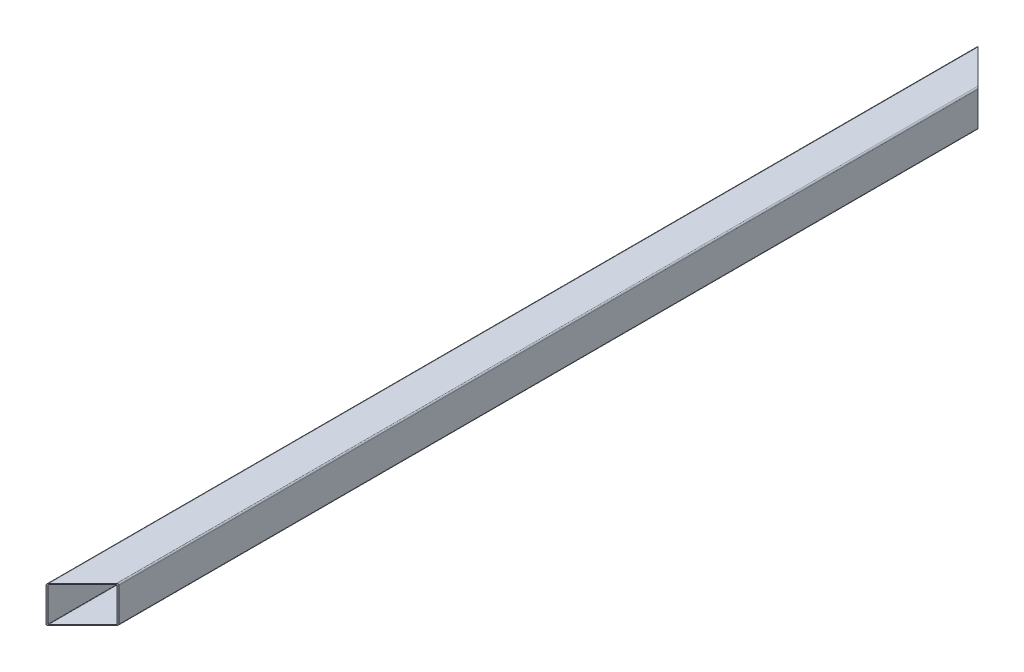
ISO-10303-21;
HEADER;
FILE_DESCRIPTION(('STEP AP214'),'2;1');
FILE_NAME('part.step','',(''),(''),'','','');
FILE_SCHEMA(('AUTOMOTIVE_DESIGN { 1 0 10303 214 1 1 1 1 }'));
ENDSEC;
DATA;
#1=APPLICATION_CONTEXT('core data for automotive mechanical design processes');
#2=APPLICATION_PROTOCOL_DEFINITION('international standard','automotive_design',2000,#1);
#3=PRODUCT_CONTEXT('',#1,'mechanical');
#4=PRODUCT('Part','Part','',(#3));
#5=PRODUCT_RELATED_PRODUCT_CATEGORY('part','',(#4));
#6=PRODUCT_DEFINITION_FORMATION('','',#4);
#7=PRODUCT_DEFINITION_CONTEXT('part definition',#1,'design');
#8=PRODUCT_DEFINITION('design','',#6,#7);
#9=PRODUCT_DEFINITION_SHAPE('','',#8);
#10=(LENGTH_UNIT() NAMED_UNIT(*) SI_UNIT(.MILLI.,.METRE.));
#11=(NAMED_UNIT(*) PLANE_ANGLE_UNIT() SI_UNIT($,.RADIAN.));
#12=(NAMED_UNIT(*) SI_UNIT($,.STERADIAN.) SOLID_ANGLE_UNIT());
#13=UNCERTAINTY_MEASURE_WITH_UNIT(LENGTH_MEASURE(1.E-05),#10,'distance_accuracy_value','');
#14=(GEOMETRIC_REPRESENTATION_CONTEXT(3) GLOBAL_UNCERTAINTY_ASSIGNED_CONTEXT((#13)) GLOBAL_UNIT_ASSIGNED_CONTEXT((#10,
#11,#12)) REPRESENTATION_CONTEXT('',''));
#15=CARTESIAN_POINT('',(0.,0.,0.));
#16=DIRECTION('',(0.,0.,1.));
#17=DIRECTION('',(1.,0.,0.));
#18=AXIS2_PLACEMENT_3D('',#15,#16,#17);
#19=CARTESIAN_POINT('',(-18.5,18.5,-1020.));
#20=DIRECTION('',(0.,0.,1.));
#21=DIRECTION('',(1.,0.,0.));
#22=AXIS2_PLACEMENT_3D('',#19,#20,#21);
#23=CYLINDRICAL_SURFACE('',#22,1.5);
#24=DIRECTION('',(0.,0.,1.));
#25=VECTOR('',#24,1.);
#26=CARTESIAN_POINT('',(-20.,18.5,-1020.));
#27=LINE('',#26,#25);
#28=CARTESIAN_POINT('',(-20.,18.5,-1020.));
#29=VERTEX_POINT('',#28);
#30=CARTESIAN_POINT('',(-20.,18.5,0.));
#31=VERTEX_POINT('',#30);
#32=EDGE_CURVE('E201',#29,#31,#27,.T.);
#33=ORIENTED_EDGE('',*,*,#32,.T.);
#34=CARTESIAN_POINT('',(-18.5,18.5,-1.50000000000006));
#35=DIRECTION('',(-0.707106781186556,0.,-0.707106781186539));
#36=DIRECTION('',(-0.707106781186539,0.,0.707106781186556));
#37=AXIS2_PLACEMENT_3D('',#34,#35,#36);
#38=ELLIPSE('',#37,2.12132034355966,1.5);
#39=CARTESIAN_POINT('',(-18.5000000000001,20.,-1.49999999999995));
#40=VERTEX_POINT('',#39);
#41=EDGE_CURVE('E181',#31,#40,#38,.T.);
#42=ORIENTED_EDGE('',*,*,#41,.T.);
#43=DIRECTION('',(0.,0.,1.));
#44=VECTOR('',#43,1.);
#45=CARTESIAN_POINT('',(-18.5,20.,-1020.));
#46=LINE('',#45,#44);
#47=CARTESIAN_POINT('',(-18.5,20.,-1018.5));
#48=VERTEX_POINT('',#47);
#49=EDGE_CURVE('E12',#48,#40,#46,.T.);
#50=ORIENTED_EDGE('',*,*,#49,.F.);
#51=CARTESIAN_POINT('',(-18.5,18.5,-1018.5));
#52=DIRECTION('',(-0.707106781186539,0.,0.707106781186556));
#53=DIRECTION('',(0.707106781186556,0.,0.707106781186539));
#54=AXIS2_PLACEMENT_3D('',#51,#52,#53);
#55=ELLIPSE('',#54,2.12132034355961,1.5);
#56=EDGE_CURVE('E187',#48,#29,#55,.T.);
#57=ORIENTED_EDGE('',*,*,#56,.T.);
#58=EDGE_LOOP('',(#33,#42,#50,#57));
#59=FACE_BOUND('',#58,.T.);
#60=ADVANCED_FACE('F61',(#59),#23,.T.);
#61=CARTESIAN_POINT('',(-18.5,20.,-1020.));
#62=DIRECTION('',(0.,-1.,0.));
#63=DIRECTION('',(0.,0.,-1.));
#64=AXIS2_PLACEMENT_3D('',#61,#62,#63);
#65=PLANE('',#64);
#66=ORIENTED_EDGE('',*,*,#49,.T.);
#67=DIRECTION('',(0.707106781186539,0.,-0.707106781186556));
#68=VECTOR('',#67,1.);
#69=CARTESIAN_POINT('',(490.75,20.,-510.750000000012));
#70=LINE('',#69,#68);
#71=CARTESIAN_POINT('',(18.5,20.,-38.5000000000009));
#72=VERTEX_POINT('',#71);
#73=EDGE_CURVE('E267',#40,#72,#70,.T.);
#74=ORIENTED_EDGE('',*,*,#73,.T.);
#75=DIRECTION('',(0.,0.,1.));
#76=VECTOR('',#75,1.);
#77=CARTESIAN_POINT('',(18.5,20.,-1020.));
#78=LINE('',#77,#76);
#79=CARTESIAN_POINT('',(18.5,20.,-981.500000000001));
#80=VERTEX_POINT('',#79);
#81=EDGE_CURVE('E70',#80,#72,#78,.T.);
#82=ORIENTED_EDGE('',*,*,#81,.F.);
#83=DIRECTION('',(-0.707106781186556,0.,-0.707106781186539));
#84=VECTOR('',#83,1.);
#85=CARTESIAN_POINT('',(-19.25,20.,-1019.25));
#86=LINE('',#85,#84);
#87=EDGE_CURVE('E298',#80,#48,#86,.T.);
#88=ORIENTED_EDGE('',*,*,#87,.T.);
#89=EDGE_LOOP('',(#66,#74,#82,#88));
#90=FACE_BOUND('',#89,.T.);
#91=ADVANCED_FACE('F308',(#90),#65,.F.);
#92=CARTESIAN_POINT('',(18.5,18.5,-1020.));
#93=DIRECTION('',(0.,0.,1.));
#94=DIRECTION('',(1.,0.,0.));
#95=AXIS2_PLACEMENT_3D('',#92,#93,#94);
#96=CYLINDRICAL_SURFACE('',#95,1.5);
#97=ORIENTED_EDGE('',*,*,#81,.T.);
#98=CARTESIAN_POINT('',(18.5,18.5,-38.5000000000009));
#99=DIRECTION('',(-0.707106781186556,0.,-0.707106781186539));
#100=DIRECTION('',(-0.707106781186539,0.,0.707106781186556));
#101=AXIS2_PLACEMENT_3D('',#98,#99,#100);
#102=ELLIPSE('',#101,2.12132034355966,1.5);
#103=CARTESIAN_POINT('',(20.,18.5,-40.0000000000009));
#104=VERTEX_POINT('',#103);
#105=EDGE_CURVE('E264',#72,#104,#102,.T.);
#106=ORIENTED_EDGE('',*,*,#105,.T.);
#107=DIRECTION('',(0.,0.,1.));
#108=VECTOR('',#107,1.);
#109=CARTESIAN_POINT('',(20.,18.5,-1020.));
#110=LINE('',#109,#108);
#111=CARTESIAN_POINT('',(20.,18.5,-980.000000000001));
#112=VERTEX_POINT('',#111);
#113=EDGE_CURVE('E212',#112,#104,#110,.T.);
#114=ORIENTED_EDGE('',*,*,#113,.F.);
#115=CARTESIAN_POINT('',(18.5,18.5,-981.500000000001));
#116=DIRECTION('',(-0.707106781186539,0.,0.707106781186556));
#117=DIRECTION('',(0.707106781186556,0.,0.707106781186539));
#118=AXIS2_PLACEMENT_3D('',#115,#116,#117);
#119=ELLIPSE('',#118,2.12132034355961,1.5);
#120=EDGE_CURVE('E295',#112,#80,#119,.T.);
#121=ORIENTED_EDGE('',*,*,#120,.T.);
#122=EDGE_LOOP('',(#97,#106,#114,#121));
#123=FACE_BOUND('',#122,.T.);
#124=ADVANCED_FACE('F312',(#123),#96,.T.);
#125=CARTESIAN_POINT('',(20.,-18.5,-1020.));
#126=DIRECTION('',(-1.,0.,0.));
#127=DIRECTION('',(0.,0.,1.));
#128=AXIS2_PLACEMENT_3D('',#125,#126,#127);
#129=PLANE('',#128);
#130=ORIENTED_EDGE('',*,*,#113,.T.);
#131=DIRECTION('',(0.,-1.,0.));
#132=VECTOR('',#131,1.);
#133=CARTESIAN_POINT('',(20.,-18.5,-40.0000000000009));
#134=LINE('',#133,#132);
#135=CARTESIAN_POINT('',(20.,-18.5,-40.0000000000009));
#136=VERTEX_POINT('',#135);
#137=EDGE_CURVE('E261',#104,#136,#134,.T.);
#138=ORIENTED_EDGE('',*,*,#137,.T.);
#139=DIRECTION('',(0.,0.,1.));
#140=VECTOR('',#139,1.);
#141=CARTESIAN_POINT('',(20.,-18.5,-1020.));
#142=LINE('',#141,#140);
#143=CARTESIAN_POINT('',(20.,-18.5,-980.000000000001));
#144=VERTEX_POINT('',#143);
#145=EDGE_CURVE('E209',#144,#136,#142,.T.);
#146=ORIENTED_EDGE('',*,*,#145,.F.);
#147=DIRECTION('',(0.,1.,0.));
#148=VECTOR('',#147,1.);
#149=CARTESIAN_POINT('',(20.,-18.5,-980.000000000001));
#150=LINE('',#149,#148);
#151=EDGE_CURVE('E292',#144,#112,#150,.T.);
#152=ORIENTED_EDGE('',*,*,#151,.T.);
#153=EDGE_LOOP('',(#130,#138,#146,#152));
#154=FACE_BOUND('',#153,.T.);
#155=ADVANCED_FACE('F314',(#154),#129,.F.);
#156=CARTESIAN_POINT('',(18.5,-18.5,-1020.));
#157=DIRECTION('',(0.,0.,1.));
#158=DIRECTION('',(1.,0.,0.));
#159=AXIS2_PLACEMENT_3D('',#156,#157,#158);
#160=CYLINDRICAL_SURFACE('',#159,1.5);
#161=ORIENTED_EDGE('',*,*,#145,.T.);
#162=CARTESIAN_POINT('',(18.5,-18.5,-38.5000000000009));
#163=DIRECTION('',(-0.707106781186556,0.,-0.707106781186539));
#164=DIRECTION('',(-0.707106781186539,0.,0.707106781186556));
#165=AXIS2_PLACEMENT_3D('',#162,#163,#164);
#166=ELLIPSE('',#165,2.12132034355967,1.5);
#167=CARTESIAN_POINT('',(18.5,-20.,-38.5000000000009));
#168=VERTEX_POINT('',#167);
#169=EDGE_CURVE('E258',#136,#168,#166,.T.);
#170=ORIENTED_EDGE('',*,*,#169,.T.);
#171=DIRECTION('',(0.,0.,1.));
#172=VECTOR('',#171,1.);
#173=CARTESIAN_POINT('',(18.5,-20.,-1020.));
#174=LINE('',#173,#172);
#175=CARTESIAN_POINT('',(18.5,-20.,-981.500000000001));
#176=VERTEX_POINT('',#175);
#177=EDGE_CURVE('E203',#176,#168,#174,.T.);
#178=ORIENTED_EDGE('',*,*,#177,.F.);
#179=CARTESIAN_POINT('',(18.5,-18.5,-981.500000000001));
#180=DIRECTION('',(-0.707106781186539,0.,0.707106781186556));
#181=DIRECTION('',(0.707106781186556,0.,0.707106781186539));
#182=AXIS2_PLACEMENT_3D('',#179,#180,#181);
#183=ELLIPSE('',#182,2.12132034355962,1.5);
#184=EDGE_CURVE('E289',#176,#144,#183,.T.);
#185=ORIENTED_EDGE('',*,*,#184,.T.);
#186=EDGE_LOOP('',(#161,#170,#178,#185));
#187=FACE_BOUND('',#186,.T.);
#188=ADVANCED_FACE('F318',(#187),#160,.T.);
#189=CARTESIAN_POINT('',(18.5,-20.,-1020.));
#190=DIRECTION('',(0.,1.,0.));
#191=DIRECTION('',(0.,0.,1.));
#192=AXIS2_PLACEMENT_3D('',#189,#190,#191);
#193=PLANE('',#192);
#194=ORIENTED_EDGE('',*,*,#177,.T.);
#195=DIRECTION('',(-0.707106781186539,0.,0.707106781186556));
#196=VECTOR('',#195,1.);
#197=CARTESIAN_POINT('',(509.25,-20.,-529.250000000012));
#198=LINE('',#197,#196);
#199=CARTESIAN_POINT('',(-18.5,-20.,-1.50000000000006));
#200=VERTEX_POINT('',#199);
#201=EDGE_CURVE('E198',#168,#200,#198,.T.);
#202=ORIENTED_EDGE('',*,*,#201,.T.);
#203=DIRECTION('',(0.,0.,1.));
#204=VECTOR('',#203,1.);
#205=CARTESIAN_POINT('',(-18.5,-20.,-1020.));
#206=LINE('',#205,#204);
#207=CARTESIAN_POINT('',(-18.5,-20.,-1018.5));
#208=VERTEX_POINT('',#207);
#209=EDGE_CURVE('E197',#208,#200,#206,.T.);
#210=ORIENTED_EDGE('',*,*,#209,.F.);
#211=DIRECTION('',(0.707106781186556,0.,0.707106781186539));
#212=VECTOR('',#211,1.);
#213=CARTESIAN_POINT('',(-0.749999999999529,-20.,-1000.75));
#214=LINE('',#213,#212);
#215=EDGE_CURVE('E286',#208,#176,#214,.T.);
#216=ORIENTED_EDGE('',*,*,#215,.T.);
#217=EDGE_LOOP('',(#194,#202,#210,#216));
#218=FACE_BOUND('',#217,.T.);
#219=ADVANCED_FACE('F320',(#218),#193,.F.);
#220=CARTESIAN_POINT('',(-18.5,-18.5,-1020.));
#221=DIRECTION('',(0.,0.,1.));
#222=DIRECTION('',(1.,0.,0.));
#223=AXIS2_PLACEMENT_3D('',#220,#221,#222);
#224=CYLINDRICAL_SURFACE('',#223,1.5);
#225=ORIENTED_EDGE('',*,*,#209,.T.);
#226=CARTESIAN_POINT('',(-18.5,-18.5,-1.50000000000006));
#227=DIRECTION('',(-0.707106781186556,0.,-0.707106781186539));
#228=DIRECTION('',(-0.707106781186539,0.,0.707106781186556));
#229=AXIS2_PLACEMENT_3D('',#226,#227,#228);
#230=ELLIPSE('',#229,2.12132034355967,1.5);
#231=CARTESIAN_POINT('',(-20.,-18.5,0.));
#232=VERTEX_POINT('',#231);
#233=EDGE_CURVE('E178',#200,#232,#230,.T.);
#234=ORIENTED_EDGE('',*,*,#233,.T.);
#235=DIRECTION('',(0.,0.,1.));
#236=VECTOR('',#235,1.);
#237=CARTESIAN_POINT('',(-20.,-18.5,-1020.));
#238=LINE('',#237,#236);
#239=CARTESIAN_POINT('',(-20.,-18.5,-1020.));
#240=VERTEX_POINT('',#239);
#241=EDGE_CURVE('E194',#240,#232,#238,.T.);
#242=ORIENTED_EDGE('',*,*,#241,.F.);
#243=CARTESIAN_POINT('',(-18.5,-18.5,-1018.5));
#244=DIRECTION('',(-0.707106781186539,0.,0.707106781186556));
#245=DIRECTION('',(0.707106781186556,0.,0.707106781186539));
#246=AXIS2_PLACEMENT_3D('',#243,#244,#245);
#247=ELLIPSE('',#246,2.12132034355962,1.5);
#248=EDGE_CURVE('E284',#240,#208,#247,.T.);
#249=ORIENTED_EDGE('',*,*,#248,.T.);
#250=EDGE_LOOP('',(#225,#234,#242,#249));
#251=FACE_BOUND('',#250,.T.);
#252=ADVANCED_FACE('F192',(#251),#224,.T.);
#253=CARTESIAN_POINT('',(18.5,18.5,-1020.));
#254=DIRECTION('',(0.,0.,1.));
#255=DIRECTION('',(1.,0.,0.));
#256=AXIS2_PLACEMENT_3D('',#253,#254,#255);
#257=CYLINDRICAL_SURFACE('',#256,0.3);
#258=CARTESIAN_POINT('',(18.5,18.5,-38.5000000000009));
#259=DIRECTION('',(-0.707106781186556,0.,-0.707106781186539));
#260=DIRECTION('',(-0.707106781186539,0.,0.707106781186556));
#261=AXIS2_PLACEMENT_3D('',#258,#259,#260);
#262=ELLIPSE('',#261,0.424264068711934,0.3);
#263=CARTESIAN_POINT('',(18.5,18.8,-38.500000000001));
#264=VERTEX_POINT('',#263);
#265=CARTESIAN_POINT('',(18.8,18.5,-38.8000000000009));
#266=VERTEX_POINT('',#265);
#267=EDGE_CURVE('E78',#264,#266,#262,.T.);
#268=ORIENTED_EDGE('',*,*,#267,.F.);
#269=DIRECTION('',(0.,0.,1.));
#270=VECTOR('',#269,1.);
#271=CARTESIAN_POINT('',(18.5,18.8,-1020.));
#272=LINE('',#271,#270);
#273=CARTESIAN_POINT('',(18.5,18.8,-981.500000000001));
#274=VERTEX_POINT('',#273);
#275=EDGE_CURVE('E65',#274,#264,#272,.T.);
#276=ORIENTED_EDGE('',*,*,#275,.F.);
#277=CARTESIAN_POINT('',(18.5,18.5,-981.500000000001));
#278=DIRECTION('',(-0.707106781186539,0.,0.707106781186556));
#279=DIRECTION('',(0.707106781186556,0.,0.707106781186539));
#280=AXIS2_PLACEMENT_3D('',#277,#278,#279);
#281=ELLIPSE('',#280,0.424264068711923,0.3);
#282=CARTESIAN_POINT('',(18.8,18.5,-981.200000000001));
#283=VERTEX_POINT('',#282);
#284=EDGE_CURVE('E250',#283,#274,#281,.T.);
#285=ORIENTED_EDGE('',*,*,#284,.F.);
#286=DIRECTION('',(0.,0.,1.));
#287=VECTOR('',#286,1.);
#288=CARTESIAN_POINT('',(18.8,18.5,-1020.));
#289=LINE('',#288,#287);
#290=EDGE_CURVE('E217',#283,#266,#289,.T.);
#291=ORIENTED_EDGE('',*,*,#290,.T.);
#292=EDGE_LOOP('',(#268,#276,#285,#291));
#293=FACE_BOUND('',#292,.T.);
#294=ADVANCED_FACE('F63',(#293),#257,.F.);
#295=CARTESIAN_POINT('',(-18.5,18.8,-1020.));
#296=DIRECTION('',(0.,-1.,0.));
#297=DIRECTION('',(0.,0.,-1.));
#298=AXIS2_PLACEMENT_3D('',#295,#296,#297);
#299=PLANE('',#298);
#300=DIRECTION('',(0.707106781186539,0.,-0.707106781186556));
#301=VECTOR('',#300,1.);
#302=CARTESIAN_POINT('',(490.75,18.8,-510.750000000012));
#303=LINE('',#302,#301);
#304=CARTESIAN_POINT('',(-18.5,18.8,-1.50000000000006));
#305=VERTEX_POINT('',#304);
#306=EDGE_CURVE('E246',#305,#264,#303,.T.);
#307=ORIENTED_EDGE('',*,*,#306,.F.);
#308=DIRECTION('',(0.,0.,1.));
#309=VECTOR('',#308,1.);
#310=CARTESIAN_POINT('',(-18.5,18.8,-1020.));
#311=LINE('',#310,#309);
#312=CARTESIAN_POINT('',(-18.5,18.8,-1018.5));
#313=VERTEX_POINT('',#312);
#314=EDGE_CURVE('E234',#313,#305,#311,.T.);
#315=ORIENTED_EDGE('',*,*,#314,.F.);
#316=DIRECTION('',(-0.707106781186556,0.,-0.707106781186539));
#317=VECTOR('',#316,1.);
#318=CARTESIAN_POINT('',(-19.25,18.8,-1019.25));
#319=LINE('',#318,#317);
#320=EDGE_CURVE('E247',#274,#313,#319,.T.);
#321=ORIENTED_EDGE('',*,*,#320,.F.);
#322=ORIENTED_EDGE('',*,*,#275,.T.);
#323=EDGE_LOOP('',(#307,#315,#321,#322));
#324=FACE_BOUND('',#323,.T.);
#325=ADVANCED_FACE('F245',(#324),#299,.T.);
#326=CARTESIAN_POINT('',(-18.5,18.5,-1020.));
#327=DIRECTION('',(0.,0.,1.));
#328=DIRECTION('',(1.,0.,0.));
#329=AXIS2_PLACEMENT_3D('',#326,#327,#328);
#330=CYLINDRICAL_SURFACE('',#329,0.3);
#331=CARTESIAN_POINT('',(-18.5,18.5,-1.50000000000006));
#332=DIRECTION('',(-0.707106781186556,0.,-0.707106781186539));
#333=DIRECTION('',(-0.707106781186539,0.,0.707106781186556));
#334=AXIS2_PLACEMENT_3D('',#331,#332,#333);
#335=ELLIPSE('',#334,0.424264068711934,0.3);
#336=CARTESIAN_POINT('',(-18.8,18.5,-1.20000000000009));
#337=VERTEX_POINT('',#336);
#338=EDGE_CURVE('E253',#337,#305,#335,.T.);
#339=ORIENTED_EDGE('',*,*,#338,.F.);
#340=DIRECTION('',(0.,0.,1.));
#341=VECTOR('',#340,1.);
#342=CARTESIAN_POINT('',(-18.8,18.5,-1020.));
#343=LINE('',#342,#341);
#344=CARTESIAN_POINT('',(-18.8,18.5,-1018.8));
#345=VERTEX_POINT('',#344);
#346=EDGE_CURVE('E232',#345,#337,#343,.T.);
#347=ORIENTED_EDGE('',*,*,#346,.F.);
#348=CARTESIAN_POINT('',(-18.5,18.5,-1018.5));
#349=DIRECTION('',(-0.707106781186539,0.,0.707106781186556));
#350=DIRECTION('',(0.707106781186556,0.,0.707106781186539));
#351=AXIS2_PLACEMENT_3D('',#348,#349,#350);
#352=ELLIPSE('',#351,0.424264068711923,0.3);
#353=EDGE_CURVE('E280',#313,#345,#352,.T.);
#354=ORIENTED_EDGE('',*,*,#353,.F.);
#355=ORIENTED_EDGE('',*,*,#314,.T.);
#356=EDGE_LOOP('',(#339,#347,#354,#355));
#357=FACE_BOUND('',#356,.T.);
#358=ADVANCED_FACE('F356',(#357),#330,.F.);
#359=CARTESIAN_POINT('',(-18.8,18.5,-1020.));
#360=DIRECTION('',(1.,0.,0.));
#361=DIRECTION('',(0.,0.,-1.));
#362=AXIS2_PLACEMENT_3D('',#359,#360,#361);
#363=PLANE('',#362);
#364=DIRECTION('',(0.,1.,0.));
#365=VECTOR('',#364,1.);
#366=CARTESIAN_POINT('',(-18.8,18.5,-1.20000000000009));
#367=LINE('',#366,#365);
#368=CARTESIAN_POINT('',(-18.8,-18.5,-1.20000000000009));
#369=VERTEX_POINT('',#368);
#370=EDGE_CURVE('E513',#369,#337,#367,.T.);
#371=ORIENTED_EDGE('',*,*,#370,.F.);
#372=DIRECTION('',(0.,0.,1.));
#373=VECTOR('',#372,1.);
#374=CARTESIAN_POINT('',(-18.8,-18.5,-1020.));
#375=LINE('',#374,#373);
#376=CARTESIAN_POINT('',(-18.8,-18.5,-1018.8));
#377=VERTEX_POINT('',#376);
#378=EDGE_CURVE('E229',#377,#369,#375,.T.);
#379=ORIENTED_EDGE('',*,*,#378,.F.);
#380=DIRECTION('',(0.,-1.,0.));
#381=VECTOR('',#380,1.);
#382=CARTESIAN_POINT('',(-18.8,18.5,-1018.8));
#383=LINE('',#382,#381);
#384=EDGE_CURVE('E278',#345,#377,#383,.T.);
#385=ORIENTED_EDGE('',*,*,#384,.F.);
#386=ORIENTED_EDGE('',*,*,#346,.T.);
#387=EDGE_LOOP('',(#371,#379,#385,#386));
#388=FACE_BOUND('',#387,.T.);
#389=ADVANCED_FACE('F352',(#388),#363,.T.);
#390=CARTESIAN_POINT('',(-18.5,-18.5,-1020.));
#391=DIRECTION('',(0.,0.,1.));
#392=DIRECTION('',(1.,0.,0.));
#393=AXIS2_PLACEMENT_3D('',#390,#391,#392);
#394=CYLINDRICAL_SURFACE('',#393,0.300000000000005);
#395=CARTESIAN_POINT('',(-18.5,-18.5,-1.50000000000006));
#396=DIRECTION('',(-0.707106781186556,0.,-0.707106781186539));
#397=DIRECTION('',(-0.707106781186539,0.,0.707106781186556));
#398=AXIS2_PLACEMENT_3D('',#395,#396,#397);
#399=ELLIPSE('',#398,0.424264068711941,0.300000000000005);
#400=CARTESIAN_POINT('',(-18.5,-18.8,-1.50000000000006));
#401=VERTEX_POINT('',#400);
#402=EDGE_CURVE('E508',#401,#369,#399,.T.);
#403=ORIENTED_EDGE('',*,*,#402,.F.);
#404=DIRECTION('',(0.,0.,1.));
#405=VECTOR('',#404,1.);
#406=CARTESIAN_POINT('',(-18.5,-18.8,-1020.));
#407=LINE('',#406,#405);
#408=CARTESIAN_POINT('',(-18.5,-18.8,-1018.5));
#409=VERTEX_POINT('',#408);
#410=EDGE_CURVE('E226',#409,#401,#407,.T.);
#411=ORIENTED_EDGE('',*,*,#410,.F.);
#412=CARTESIAN_POINT('',(-18.5,-18.5,-1018.5));
#413=DIRECTION('',(-0.707106781186539,0.,0.707106781186556));
#414=DIRECTION('',(0.707106781186556,0.,0.707106781186539));
#415=AXIS2_PLACEMENT_3D('',#412,#413,#414);
#416=ELLIPSE('',#415,0.424264068711931,0.300000000000005);
#417=EDGE_CURVE('E276',#377,#409,#416,.T.);
#418=ORIENTED_EDGE('',*,*,#417,.F.);
#419=ORIENTED_EDGE('',*,*,#378,.T.);
#420=EDGE_LOOP('',(#403,#411,#418,#419));
#421=FACE_BOUND('',#420,.T.);
#422=ADVANCED_FACE('F348',(#421),#394,.F.);
#423=CARTESIAN_POINT('',(18.5,-18.8,-1020.));
#424=DIRECTION('',(0.,1.,0.));
#425=DIRECTION('',(0.,0.,1.));
#426=AXIS2_PLACEMENT_3D('',#423,#424,#425);
#427=PLANE('',#426);
#428=DIRECTION('',(-0.707106781186539,0.,0.707106781186556));
#429=VECTOR('',#428,1.);
#430=CARTESIAN_POINT('',(509.25,-18.8,-529.250000000012));
#431=LINE('',#430,#429);
#432=CARTESIAN_POINT('',(18.5,-18.8,-38.5000000000009));
#433=VERTEX_POINT('',#432);
#434=EDGE_CURVE('E505',#433,#401,#431,.T.);
#435=ORIENTED_EDGE('',*,*,#434,.F.);
#436=DIRECTION('',(0.,0.,1.));
#437=VECTOR('',#436,1.);
#438=CARTESIAN_POINT('',(18.5,-18.8,-1020.));
#439=LINE('',#438,#437);
#440=CARTESIAN_POINT('',(18.5,-18.8,-981.500000000001));
#441=VERTEX_POINT('',#440);
#442=EDGE_CURVE('E223',#441,#433,#439,.T.);
#443=ORIENTED_EDGE('',*,*,#442,.F.);
#444=DIRECTION('',(0.707106781186556,0.,0.707106781186539));
#445=VECTOR('',#444,1.);
#446=CARTESIAN_POINT('',(-0.749999999999529,-18.8,-1000.75));
#447=LINE('',#446,#445);
#448=EDGE_CURVE('E274',#409,#441,#447,.T.);
#449=ORIENTED_EDGE('',*,*,#448,.F.);
#450=ORIENTED_EDGE('',*,*,#410,.T.);
#451=EDGE_LOOP('',(#435,#443,#449,#450));
#452=FACE_BOUND('',#451,.T.);
#453=ADVANCED_FACE('F344',(#452),#427,.T.);
#454=CARTESIAN_POINT('',(18.5,-18.5,-1020.));
#455=DIRECTION('',(0.,0.,1.));
#456=DIRECTION('',(1.,0.,0.));
#457=AXIS2_PLACEMENT_3D('',#454,#455,#456);
#458=CYLINDRICAL_SURFACE('',#457,0.300000000000003);
#459=CARTESIAN_POINT('',(18.5,-18.5,-38.5000000000009));
#460=DIRECTION('',(-0.707106781186556,0.,-0.707106781186539));
#461=DIRECTION('',(-0.707106781186539,0.,0.707106781186556));
#462=AXIS2_PLACEMENT_3D('',#459,#460,#461);
#463=ELLIPSE('',#462,0.424264068711938,0.300000000000003);
#464=CARTESIAN_POINT('',(18.8,-18.5,-38.8000000000009));
#465=VERTEX_POINT('',#464);
#466=EDGE_CURVE('E503',#465,#433,#463,.T.);
#467=ORIENTED_EDGE('',*,*,#466,.F.);
#468=DIRECTION('',(0.,0.,1.));
#469=VECTOR('',#468,1.);
#470=CARTESIAN_POINT('',(18.8,-18.5,-1020.));
#471=LINE('',#470,#469);
#472=CARTESIAN_POINT('',(18.8,-18.5,-981.200000000001));
#473=VERTEX_POINT('',#472);
#474=EDGE_CURVE('E220',#473,#465,#471,.T.);
#475=ORIENTED_EDGE('',*,*,#474,.F.);
#476=CARTESIAN_POINT('',(18.5,-18.5,-981.500000000001));
#477=DIRECTION('',(-0.707106781186539,0.,0.707106781186556));
#478=DIRECTION('',(0.707106781186556,0.,0.707106781186539));
#479=AXIS2_PLACEMENT_3D('',#476,#477,#478);
#480=ELLIPSE('',#479,0.424264068711928,0.300000000000003);
#481=EDGE_CURVE('E86',#441,#473,#480,.T.);
#482=ORIENTED_EDGE('',*,*,#481,.F.);
#483=ORIENTED_EDGE('',*,*,#442,.T.);
#484=EDGE_LOOP('',(#467,#475,#482,#483));
#485=FACE_BOUND('',#484,.T.);
#486=ADVANCED_FACE('F340',(#485),#458,.F.);
#487=CARTESIAN_POINT('',(18.8,-18.5,-1020.));
#488=DIRECTION('',(-1.,0.,0.));
#489=DIRECTION('',(0.,0.,1.));
#490=AXIS2_PLACEMENT_3D('',#487,#488,#489);
#491=PLANE('',#490);
#492=DIRECTION('',(0.,-1.,0.));
#493=VECTOR('',#492,1.);
#494=CARTESIAN_POINT('',(18.8,-18.5,-38.8000000000009));
#495=LINE('',#494,#493);
#496=EDGE_CURVE('E506',#266,#465,#495,.T.);
#497=ORIENTED_EDGE('',*,*,#496,.F.);
#498=ORIENTED_EDGE('',*,*,#290,.F.);
#499=DIRECTION('',(0.,1.,0.));
#500=VECTOR('',#499,1.);
#501=CARTESIAN_POINT('',(18.8,-18.5,-981.200000000001));
#502=LINE('',#501,#500);
#503=EDGE_CURVE('E271',#473,#283,#502,.T.);
#504=ORIENTED_EDGE('',*,*,#503,.F.);
#505=ORIENTED_EDGE('',*,*,#474,.T.);
#506=EDGE_LOOP('',(#497,#498,#504,#505));
#507=FACE_BOUND('',#506,.T.);
#508=ADVANCED_FACE('F337',(#507),#491,.T.);
#509=CARTESIAN_POINT('',(-20.,18.5,-1020.));
#510=DIRECTION('',(1.,0.,0.));
#511=DIRECTION('',(0.,0.,-1.));
#512=AXIS2_PLACEMENT_3D('',#509,#510,#511);
#513=PLANE('',#512);
#514=DIRECTION('',(0.,1.,0.));
#515=VECTOR('',#514,1.);
#516=CARTESIAN_POINT('',(-20.,18.5,0.));
#517=LINE('',#516,#515);
#518=EDGE_CURVE('E175',#232,#31,#517,.T.);
#519=ORIENTED_EDGE('',*,*,#518,.T.);
#520=ORIENTED_EDGE('',*,*,#32,.F.);
#521=DIRECTION('',(0.,1.,0.));
#522=VECTOR('',#521,1.);
#523=CARTESIAN_POINT('',(-20.,18.5,-1020.));
#524=LINE('',#523,#522);
#525=EDGE_CURVE('E186',#240,#29,#524,.T.);
#526=ORIENTED_EDGE('',*,*,#525,.F.);
#527=ORIENTED_EDGE('',*,*,#241,.T.);
#528=EDGE_LOOP('',(#519,#520,#526,#527));
#529=FACE_BOUND('',#528,.T.);
#530=ADVANCED_FACE('F200',(#529),#513,.F.);
#531=CARTESIAN_POINT('',(-20.,-597.,-1020.));
#532=DIRECTION('',(-0.707106781186539,0.,0.707106781186556));
#533=DIRECTION('',(0.707106781186556,0.,0.707106781186539));
#534=AXIS2_PLACEMENT_3D('',#531,#532,#533);
#535=PLANE('',#534);
#536=ORIENTED_EDGE('',*,*,#284,.T.);
#537=ORIENTED_EDGE('',*,*,#320,.T.);
#538=ORIENTED_EDGE('',*,*,#353,.T.);
#539=ORIENTED_EDGE('',*,*,#384,.T.);
#540=ORIENTED_EDGE('',*,*,#417,.T.);
#541=ORIENTED_EDGE('',*,*,#448,.T.);
#542=ORIENTED_EDGE('',*,*,#481,.T.);
#543=ORIENTED_EDGE('',*,*,#503,.T.);
#544=EDGE_LOOP('',(#536,#537,#538,#539,#540,#541,#542,#543));
#545=FACE_BOUND('',#544,.T.);
#546=ORIENTED_EDGE('',*,*,#87,.F.);
#547=ORIENTED_EDGE('',*,*,#120,.F.);
#548=ORIENTED_EDGE('',*,*,#151,.F.);
#549=ORIENTED_EDGE('',*,*,#184,.F.);
#550=ORIENTED_EDGE('',*,*,#215,.F.);
#551=ORIENTED_EDGE('',*,*,#248,.F.);
#552=ORIENTED_EDGE('',*,*,#525,.T.);
#553=ORIENTED_EDGE('',*,*,#56,.F.);
#554=EDGE_LOOP('',(#546,#547,#548,#549,#550,#551,#552,#553));
#555=FACE_BOUND('',#554,.T.);
#556=ADVANCED_FACE('F304',(#545,#555),#535,.F.);
#557=CARTESIAN_POINT('',(-20.,-597.,0.));
#558=DIRECTION('',(-0.707106781186556,0.,-0.707106781186539));
#559=DIRECTION('',(-0.707106781186539,0.,0.707106781186556));
#560=AXIS2_PLACEMENT_3D('',#557,#558,#559);
#561=PLANE('',#560);
#562=ORIENTED_EDGE('',*,*,#267,.T.);
#563=ORIENTED_EDGE('',*,*,#496,.T.);
#564=ORIENTED_EDGE('',*,*,#466,.T.);
#565=ORIENTED_EDGE('',*,*,#434,.T.);
#566=ORIENTED_EDGE('',*,*,#402,.T.);
#567=ORIENTED_EDGE('',*,*,#370,.T.);
#568=ORIENTED_EDGE('',*,*,#338,.T.);
#569=ORIENTED_EDGE('',*,*,#306,.T.);
#570=EDGE_LOOP('',(#562,#563,#564,#565,#566,#567,#568,#569));
#571=FACE_BOUND('',#570,.T.);
#572=ORIENTED_EDGE('',*,*,#518,.F.);
#573=ORIENTED_EDGE('',*,*,#233,.F.);
#574=ORIENTED_EDGE('',*,*,#201,.F.);
#575=ORIENTED_EDGE('',*,*,#169,.F.);
#576=ORIENTED_EDGE('',*,*,#137,.F.);
#577=ORIENTED_EDGE('',*,*,#105,.F.);
#578=ORIENTED_EDGE('',*,*,#73,.F.);
#579=ORIENTED_EDGE('',*,*,#41,.F.);
#580=EDGE_LOOP('',(#572,#573,#574,#575,#576,#577,#578,#579));
#581=FACE_BOUND('',#580,.T.);
#582=ADVANCED_FACE('F177',(#571,#581),#561,.F.);
#583=CLOSED_SHELL('',(#60,#91,#124,#155,#188,#219,#252,#294,#325,#358,#389,#422,#453,#486,#508,
#530,#556,#582));
#584=MANIFOLD_SOLID_BREP('B2',#583);
#585=ADVANCED_BREP_SHAPE_REPRESENTATION('',(#18,#584),#14);
#586=SHAPE_DEFINITION_REPRESENTATION(#9,#585);
ENDSEC;
END-ISO-10303-21;
